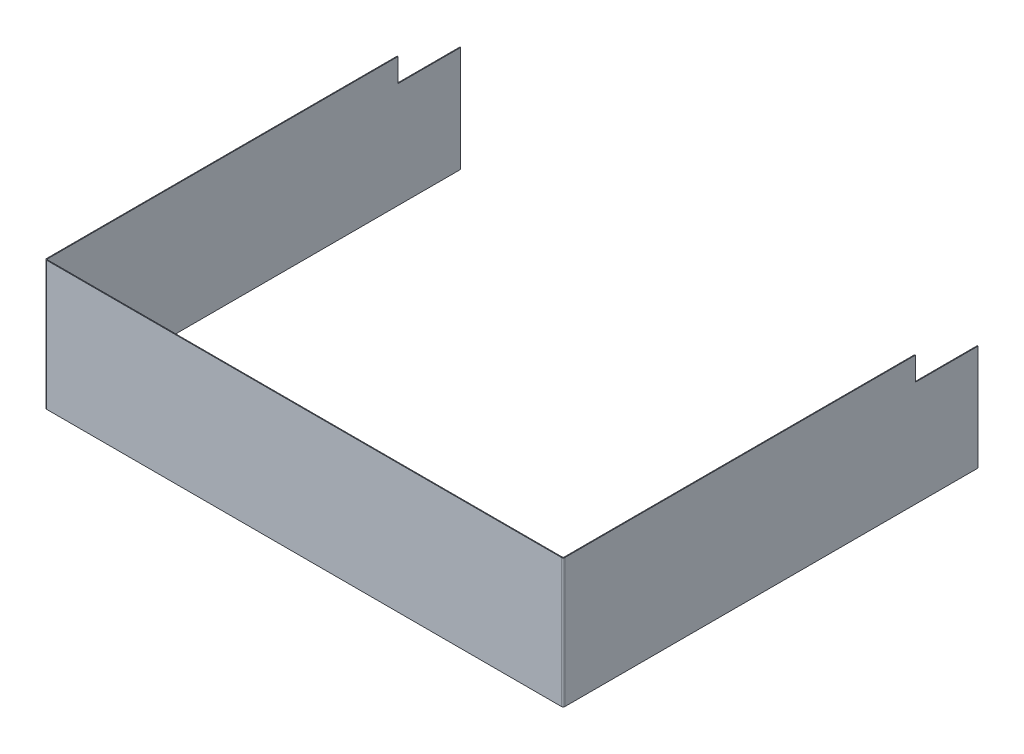
ISO-10303-21;
HEADER;
FILE_DESCRIPTION(('STEP AP214'),'2;1');
FILE_NAME('part.step','',(''),(''),'','','');
FILE_SCHEMA(('AUTOMOTIVE_DESIGN { 1 0 10303 214 1 1 1 1 }'));
ENDSEC;
DATA;
#1=APPLICATION_CONTEXT('core data for automotive mechanical design processes');
#2=APPLICATION_PROTOCOL_DEFINITION('international standard','automotive_design',2000,#1);
#3=PRODUCT_CONTEXT('',#1,'mechanical');
#4=PRODUCT('Part','Part','',(#3));
#5=PRODUCT_RELATED_PRODUCT_CATEGORY('part','',(#4));
#6=PRODUCT_DEFINITION_FORMATION('','',#4);
#7=PRODUCT_DEFINITION_CONTEXT('part definition',#1,'design');
#8=PRODUCT_DEFINITION('design','',#6,#7);
#9=PRODUCT_DEFINITION_SHAPE('','',#8);
#10=(LENGTH_UNIT() NAMED_UNIT(*) SI_UNIT(.MILLI.,.METRE.));
#11=(NAMED_UNIT(*) PLANE_ANGLE_UNIT() SI_UNIT($,.RADIAN.));
#12=(NAMED_UNIT(*) SI_UNIT($,.STERADIAN.) SOLID_ANGLE_UNIT());
#13=UNCERTAINTY_MEASURE_WITH_UNIT(LENGTH_MEASURE(1.E-05),#10,'distance_accuracy_value','');
#14=(GEOMETRIC_REPRESENTATION_CONTEXT(3) GLOBAL_UNCERTAINTY_ASSIGNED_CONTEXT((#13)) GLOBAL_UNIT_ASSIGNED_CONTEXT((#10,
#11,#12)) REPRESENTATION_CONTEXT('',''));
#15=CARTESIAN_POINT('',(0.,0.,0.));
#16=DIRECTION('',(0.,0.,1.));
#17=DIRECTION('',(1.,0.,0.));
#18=AXIS2_PLACEMENT_3D('',#15,#16,#17);
#19=CARTESIAN_POINT('',(0.,0.,-1.));
#20=DIRECTION('',(0.,0.,1.));
#21=DIRECTION('',(1.,0.,0.));
#22=AXIS2_PLACEMENT_3D('',#19,#20,#21);
#23=PLANE('',#22);
#24=DIRECTION('',(0.,1.,0.));
#25=VECTOR('',#24,1.);
#26=CARTESIAN_POINT('',(-329.,82.5,-1.));
#27=LINE('',#26,#25);
#28=CARTESIAN_POINT('',(-329.,82.4999999999999,-1.));
#29=VERTEX_POINT('',#28);
#30=CARTESIAN_POINT('',(-329.,-82.5,-1.));
#31=VERTEX_POINT('',#30);
#32=EDGE_CURVE('E208',#29,#31,#27,.F.);
#33=ORIENTED_EDGE('',*,*,#32,.F.);
#34=DIRECTION('',(-1.,0.,0.));
#35=VECTOR('',#34,1.);
#36=CARTESIAN_POINT('',(330.,82.5,-1.));
#37=LINE('',#36,#35);
#38=CARTESIAN_POINT('',(329.,82.5,-1.));
#39=VERTEX_POINT('',#38);
#40=EDGE_CURVE('E48',#39,#29,#37,.T.);
#41=ORIENTED_EDGE('',*,*,#40,.F.);
#42=DIRECTION('',(0.,-1.,0.));
#43=VECTOR('',#42,1.);
#44=CARTESIAN_POINT('',(329.,-82.5,-1.));
#45=LINE('',#44,#43);
#46=CARTESIAN_POINT('',(329.,-82.5,-1.));
#47=VERTEX_POINT('',#46);
#48=EDGE_CURVE('E261',#47,#39,#45,.F.);
#49=ORIENTED_EDGE('',*,*,#48,.F.);
#50=DIRECTION('',(1.,0.,0.));
#51=VECTOR('',#50,1.);
#52=CARTESIAN_POINT('',(330.,-82.5,-1.));
#53=LINE('',#52,#51);
#54=EDGE_CURVE('E271',#31,#47,#53,.T.);
#55=ORIENTED_EDGE('',*,*,#54,.F.);
#56=EDGE_LOOP('',(#33,#41,#49,#55));
#57=FACE_BOUND('',#56,.T.);
#58=ADVANCED_FACE('F40',(#57),#23,.F.);
#59=CARTESIAN_POINT('',(0.,0.,0.));
#60=DIRECTION('',(0.,0.,1.));
#61=DIRECTION('',(1.,0.,0.));
#62=AXIS2_PLACEMENT_3D('',#59,#60,#61);
#63=PLANE('',#62);
#64=DIRECTION('',(-1.,0.,0.));
#65=VECTOR('',#64,1.);
#66=CARTESIAN_POINT('',(330.,82.5,0.));
#67=LINE('',#66,#65);
#68=CARTESIAN_POINT('',(329.,82.5,0.));
#69=VERTEX_POINT('',#68);
#70=CARTESIAN_POINT('',(-329.,82.4999999999999,0.));
#71=VERTEX_POINT('',#70);
#72=EDGE_CURVE('E274',#69,#71,#67,.T.);
#73=ORIENTED_EDGE('',*,*,#72,.T.);
#74=DIRECTION('',(0.,1.,0.));
#75=VECTOR('',#74,1.);
#76=CARTESIAN_POINT('',(-329.,82.5,0.));
#77=LINE('',#76,#75);
#78=CARTESIAN_POINT('',(-329.,-82.5,0.));
#79=VERTEX_POINT('',#78);
#80=EDGE_CURVE('E195',#71,#79,#77,.F.);
#81=ORIENTED_EDGE('',*,*,#80,.T.);
#82=DIRECTION('',(1.,0.,0.));
#83=VECTOR('',#82,1.);
#84=CARTESIAN_POINT('',(330.,-82.5,0.));
#85=LINE('',#84,#83);
#86=CARTESIAN_POINT('',(329.,-82.5,0.));
#87=VERTEX_POINT('',#86);
#88=EDGE_CURVE('E268',#79,#87,#85,.T.);
#89=ORIENTED_EDGE('',*,*,#88,.T.);
#90=DIRECTION('',(0.,-1.,0.));
#91=VECTOR('',#90,1.);
#92=CARTESIAN_POINT('',(329.,-82.5,0.));
#93=LINE('',#92,#91);
#94=EDGE_CURVE('E248',#87,#69,#93,.F.);
#95=ORIENTED_EDGE('',*,*,#94,.T.);
#96=EDGE_LOOP('',(#73,#81,#89,#95));
#97=FACE_BOUND('',#96,.T.);
#98=ADVANCED_FACE('F281',(#97),#63,.T.);
#99=CARTESIAN_POINT('',(330.,82.5,-1.));
#100=DIRECTION('',(0.,1.,0.));
#101=DIRECTION('',(-1.,0.,0.));
#102=AXIS2_PLACEMENT_3D('',#99,#100,#101);
#103=PLANE('',#102);
#104=ORIENTED_EDGE('',*,*,#40,.T.);
#105=DIRECTION('',(0.,0.,1.));
#106=VECTOR('',#105,1.);
#107=CARTESIAN_POINT('',(-329.,82.4999999999999,-1.));
#108=LINE('',#107,#106);
#109=EDGE_CURVE('E202',#29,#71,#108,.T.);
#110=ORIENTED_EDGE('',*,*,#109,.T.);
#111=ORIENTED_EDGE('',*,*,#72,.F.);
#112=DIRECTION('',(0.,0.,1.));
#113=VECTOR('',#112,1.);
#114=CARTESIAN_POINT('',(329.,82.5,-1.));
#115=LINE('',#114,#113);
#116=EDGE_CURVE('E265',#39,#69,#115,.T.);
#117=ORIENTED_EDGE('',*,*,#116,.F.);
#118=EDGE_LOOP('',(#104,#110,#111,#117));
#119=FACE_BOUND('',#118,.T.);
#120=ADVANCED_FACE('F285',(#119),#103,.T.);
#121=CARTESIAN_POINT('',(330.,-82.5,-1.));
#122=DIRECTION('',(0.,-1.,0.));
#123=DIRECTION('',(1.,0.,0.));
#124=AXIS2_PLACEMENT_3D('',#121,#122,#123);
#125=PLANE('',#124);
#126=DIRECTION('',(0.,0.,1.));
#127=VECTOR('',#126,1.);
#128=CARTESIAN_POINT('',(-329.,-82.5,-1.));
#129=LINE('',#128,#127);
#130=EDGE_CURVE('E212',#31,#79,#129,.T.);
#131=ORIENTED_EDGE('',*,*,#130,.F.);
#132=ORIENTED_EDGE('',*,*,#54,.T.);
#133=DIRECTION('',(0.,0.,1.));
#134=VECTOR('',#133,1.);
#135=CARTESIAN_POINT('',(329.,-82.5,-1.));
#136=LINE('',#135,#134);
#137=EDGE_CURVE('E255',#47,#87,#136,.T.);
#138=ORIENTED_EDGE('',*,*,#137,.T.);
#139=ORIENTED_EDGE('',*,*,#88,.F.);
#140=EDGE_LOOP('',(#131,#132,#138,#139));
#141=FACE_BOUND('',#140,.T.);
#142=ADVANCED_FACE('F42',(#141),#125,.T.);
#143=CARTESIAN_POINT('',(329.,82.5,-2.00000000000001));
#144=DIRECTION('',(0.,1.,0.));
#145=DIRECTION('',(0.,0.,1.));
#146=AXIS2_PLACEMENT_3D('',#143,#144,#145);
#147=PLANE('',#146);
#148=DIRECTION('',(1.,0.,0.));
#149=VECTOR('',#148,1.);
#150=CARTESIAN_POINT('',(330.,82.5,-2.));
#151=LINE('',#150,#149);
#152=CARTESIAN_POINT('',(330.,82.5,-2.));
#153=VERTEX_POINT('',#152);
#154=CARTESIAN_POINT('',(331.,82.5,-2.));
#155=VERTEX_POINT('',#154);
#156=EDGE_CURVE('E215',#153,#155,#151,.T.);
#157=ORIENTED_EDGE('',*,*,#156,.F.);
#158=CARTESIAN_POINT('',(329.,82.5,-2.00000000000001));
#159=DIRECTION('',(0.,-1.,0.));
#160=DIRECTION('',(0.,0.,-1.));
#161=AXIS2_PLACEMENT_3D('',#158,#159,#160);
#162=CIRCLE('',#161,1.);
#163=EDGE_CURVE('E258',#39,#153,#162,.F.);
#164=ORIENTED_EDGE('',*,*,#163,.F.);
#165=ORIENTED_EDGE('',*,*,#116,.T.);
#166=CARTESIAN_POINT('',(329.,82.5,-2.00000000000001));
#167=DIRECTION('',(0.,-1.,0.));
#168=DIRECTION('',(0.,0.,-1.));
#169=AXIS2_PLACEMENT_3D('',#166,#167,#168);
#170=CIRCLE('',#169,2.);
#171=EDGE_CURVE('E251',#69,#155,#170,.F.);
#172=ORIENTED_EDGE('',*,*,#171,.T.);
#173=EDGE_LOOP('',(#157,#164,#165,#172));
#174=FACE_BOUND('',#173,.T.);
#175=ADVANCED_FACE('F357',(#174),#147,.T.);
#176=CARTESIAN_POINT('',(329.,-82.5,-2.00000000000001));
#177=DIRECTION('',(0.,1.,0.));
#178=DIRECTION('',(0.,0.,1.));
#179=AXIS2_PLACEMENT_3D('',#176,#177,#178);
#180=PLANE('',#179);
#181=CARTESIAN_POINT('',(329.,-82.5,-2.00000000000001));
#182=DIRECTION('',(0.,-1.,0.));
#183=DIRECTION('',(0.,0.,-1.));
#184=AXIS2_PLACEMENT_3D('',#181,#182,#183);
#185=CIRCLE('',#184,1.);
#186=CARTESIAN_POINT('',(330.,-82.5,-2.));
#187=VERTEX_POINT('',#186);
#188=EDGE_CURVE('E247',#187,#47,#185,.T.);
#189=ORIENTED_EDGE('',*,*,#188,.F.);
#190=DIRECTION('',(1.,0.,0.));
#191=VECTOR('',#190,1.);
#192=CARTESIAN_POINT('',(330.,-82.5,-2.));
#193=LINE('',#192,#191);
#194=CARTESIAN_POINT('',(331.,-82.5,-2.));
#195=VERTEX_POINT('',#194);
#196=EDGE_CURVE('E220',#187,#195,#193,.T.);
#197=ORIENTED_EDGE('',*,*,#196,.T.);
#198=CARTESIAN_POINT('',(329.,-82.5,-2.00000000000001));
#199=DIRECTION('',(0.,-1.,0.));
#200=DIRECTION('',(0.,0.,-1.));
#201=AXIS2_PLACEMENT_3D('',#198,#199,#200);
#202=CIRCLE('',#201,2.);
#203=EDGE_CURVE('E252',#195,#87,#202,.T.);
#204=ORIENTED_EDGE('',*,*,#203,.T.);
#205=ORIENTED_EDGE('',*,*,#137,.F.);
#206=EDGE_LOOP('',(#189,#197,#204,#205));
#207=FACE_BOUND('',#206,.T.);
#208=ADVANCED_FACE('F351',(#207),#180,.F.);
#209=CARTESIAN_POINT('',(329.,-82.5,-2.00000000000001));
#210=DIRECTION('',(0.,-1.,0.));
#211=DIRECTION('',(1.,0.,0.));
#212=AXIS2_PLACEMENT_3D('',#209,#210,#211);
#213=CYLINDRICAL_SURFACE('',#212,2.);
#214=ORIENTED_EDGE('',*,*,#94,.F.);
#215=ORIENTED_EDGE('',*,*,#203,.F.);
#216=DIRECTION('',(0.,-1.,0.));
#217=VECTOR('',#216,1.);
#218=CARTESIAN_POINT('',(331.,0.,-2.));
#219=LINE('',#218,#217);
#220=EDGE_CURVE('E223',#155,#195,#219,.T.);
#221=ORIENTED_EDGE('',*,*,#220,.F.);
#222=ORIENTED_EDGE('',*,*,#171,.F.);
#223=EDGE_LOOP('',(#214,#215,#221,#222));
#224=FACE_BOUND('',#223,.T.);
#225=ADVANCED_FACE('F365',(#224),#213,.T.);
#226=CARTESIAN_POINT('',(329.,-82.5,-2.00000000000001));
#227=DIRECTION('',(0.,-1.,0.));
#228=DIRECTION('',(1.,0.,0.));
#229=AXIS2_PLACEMENT_3D('',#226,#227,#228);
#230=CYLINDRICAL_SURFACE('',#229,1.);
#231=ORIENTED_EDGE('',*,*,#48,.T.);
#232=ORIENTED_EDGE('',*,*,#163,.T.);
#233=DIRECTION('',(0.,-1.,0.));
#234=VECTOR('',#233,1.);
#235=CARTESIAN_POINT('',(330.,82.5,-2.));
#236=LINE('',#235,#234);
#237=EDGE_CURVE('E218',#153,#187,#236,.T.);
#238=ORIENTED_EDGE('',*,*,#237,.T.);
#239=ORIENTED_EDGE('',*,*,#188,.T.);
#240=EDGE_LOOP('',(#231,#232,#238,#239));
#241=FACE_BOUND('',#240,.T.);
#242=ADVANCED_FACE('F368',(#241),#230,.F.);
#243=CARTESIAN_POINT('',(331.,-82.5,-0.999999999999997));
#244=DIRECTION('',(0.,-1.,0.));
#245=DIRECTION('',(0.,0.,-1.));
#246=AXIS2_PLACEMENT_3D('',#243,#244,#245);
#247=PLANE('',#246);
#248=DIRECTION('',(0.,0.,1.));
#249=VECTOR('',#248,1.);
#250=CARTESIAN_POINT('',(331.,-82.5,-0.999999999999997));
#251=LINE('',#250,#249);
#252=CARTESIAN_POINT('',(331.000000000002,-82.5,-530.));
#253=VERTEX_POINT('',#252);
#254=EDGE_CURVE('E235',#253,#195,#251,.T.);
#255=ORIENTED_EDGE('',*,*,#254,.T.);
#256=ORIENTED_EDGE('',*,*,#196,.F.);
#257=DIRECTION('',(0.,0.,1.));
#258=VECTOR('',#257,1.);
#259=CARTESIAN_POINT('',(330.,-82.5,-1.));
#260=LINE('',#259,#258);
#261=CARTESIAN_POINT('',(330.000000000002,-82.5,-530.));
#262=VERTEX_POINT('',#261);
#263=EDGE_CURVE('E233',#262,#187,#260,.T.);
#264=ORIENTED_EDGE('',*,*,#263,.F.);
#265=DIRECTION('',(-1.,0.,0.));
#266=VECTOR('',#265,1.);
#267=CARTESIAN_POINT('',(331.000000000002,-82.5,-530.));
#268=LINE('',#267,#266);
#269=EDGE_CURVE('E238',#253,#262,#268,.T.);
#270=ORIENTED_EDGE('',*,*,#269,.F.);
#271=EDGE_LOOP('',(#255,#256,#264,#270));
#272=FACE_BOUND('',#271,.T.);
#273=ADVANCED_FACE('F371',(#272),#247,.T.);
#274=CARTESIAN_POINT('',(331.000000000002,82.5,-530.));
#275=DIRECTION('',(0.,1.,0.));
#276=DIRECTION('',(0.,0.,1.));
#277=AXIS2_PLACEMENT_3D('',#274,#275,#276);
#278=PLANE('',#277);
#279=DIRECTION('',(1.,0.,0.));
#280=VECTOR('',#279,1.);
#281=CARTESIAN_POINT('',(-331.000000000002,82.5,-450.000000000002));
#282=LINE('',#281,#280);
#283=CARTESIAN_POINT('',(330.000000000002,82.5,-450.));
#284=VERTEX_POINT('',#283);
#285=CARTESIAN_POINT('',(331.000000000002,82.5,-450.));
#286=VERTEX_POINT('',#285);
#287=EDGE_CURVE('E172',#284,#286,#282,.T.);
#288=ORIENTED_EDGE('',*,*,#287,.F.);
#289=DIRECTION('',(0.,0.,-1.));
#290=VECTOR('',#289,1.);
#291=CARTESIAN_POINT('',(330.000000000002,82.5,-530.));
#292=LINE('',#291,#290);
#293=EDGE_CURVE('E228',#153,#284,#292,.T.);
#294=ORIENTED_EDGE('',*,*,#293,.F.);
#295=ORIENTED_EDGE('',*,*,#156,.T.);
#296=DIRECTION('',(0.,0.,-1.));
#297=VECTOR('',#296,1.);
#298=CARTESIAN_POINT('',(331.000000000002,82.5,-530.));
#299=LINE('',#298,#297);
#300=EDGE_CURVE('E229',#155,#286,#299,.T.);
#301=ORIENTED_EDGE('',*,*,#300,.T.);
#302=EDGE_LOOP('',(#288,#294,#295,#301));
#303=FACE_BOUND('',#302,.T.);
#304=ADVANCED_FACE('F376',(#303),#278,.T.);
#305=CARTESIAN_POINT('',(331.,0.,1.1462446702016E-12));
#306=DIRECTION('',(1.,0.,0.));
#307=DIRECTION('',(0.,0.,-1.));
#308=AXIS2_PLACEMENT_3D('',#305,#306,#307);
#309=PLANE('',#308);
#310=DIRECTION('',(0.,0.,-1.));
#311=VECTOR('',#310,1.);
#312=CARTESIAN_POINT('',(331.000000000002,52.5,-530.));
#313=LINE('',#312,#311);
#314=CARTESIAN_POINT('',(331.000000000002,52.5,-450.));
#315=VERTEX_POINT('',#314);
#316=CARTESIAN_POINT('',(331.000000000002,52.5,-530.));
#317=VERTEX_POINT('',#316);
#318=EDGE_CURVE('E55',#315,#317,#313,.T.);
#319=ORIENTED_EDGE('',*,*,#318,.F.);
#320=DIRECTION('',(0.,-1.,0.));
#321=VECTOR('',#320,1.);
#322=CARTESIAN_POINT('',(331.000000000002,52.5,-450.));
#323=LINE('',#322,#321);
#324=EDGE_CURVE('E668',#286,#315,#323,.T.);
#325=ORIENTED_EDGE('',*,*,#324,.F.);
#326=ORIENTED_EDGE('',*,*,#300,.F.);
#327=ORIENTED_EDGE('',*,*,#220,.T.);
#328=ORIENTED_EDGE('',*,*,#254,.F.);
#329=DIRECTION('',(0.,-1.,0.));
#330=VECTOR('',#329,1.);
#331=CARTESIAN_POINT('',(331.000000000002,-82.5,-530.));
#332=LINE('',#331,#330);
#333=EDGE_CURVE('E232',#317,#253,#332,.T.);
#334=ORIENTED_EDGE('',*,*,#333,.F.);
#335=EDGE_LOOP('',(#319,#325,#326,#327,#328,#334));
#336=FACE_BOUND('',#335,.T.);
#337=ADVANCED_FACE('F379',(#336),#309,.T.);
#338=CARTESIAN_POINT('',(330.,0.,1.14275318886276E-12));
#339=DIRECTION('',(1.,0.,0.));
#340=DIRECTION('',(0.,0.,-1.));
#341=AXIS2_PLACEMENT_3D('',#338,#339,#340);
#342=PLANE('',#341);
#343=DIRECTION('',(0.,-1.,0.));
#344=VECTOR('',#343,1.);
#345=CARTESIAN_POINT('',(330.000000000002,0.,-450.));
#346=LINE('',#345,#344);
#347=CARTESIAN_POINT('',(330.000000000002,52.5,-450.));
#348=VERTEX_POINT('',#347);
#349=EDGE_CURVE('E323',#284,#348,#346,.T.);
#350=ORIENTED_EDGE('',*,*,#349,.T.);
#351=DIRECTION('',(0.,0.,-1.));
#352=VECTOR('',#351,1.);
#353=CARTESIAN_POINT('',(330.,52.4999999999999,1.15186048711163E-12));
#354=LINE('',#353,#352);
#355=CARTESIAN_POINT('',(330.000000000002,52.5,-530.));
#356=VERTEX_POINT('',#355);
#357=EDGE_CURVE('E320',#348,#356,#354,.T.);
#358=ORIENTED_EDGE('',*,*,#357,.T.);
#359=DIRECTION('',(0.,-1.,0.));
#360=VECTOR('',#359,1.);
#361=CARTESIAN_POINT('',(330.000000000002,-82.5,-530.));
#362=LINE('',#361,#360);
#363=EDGE_CURVE('E241',#356,#262,#362,.T.);
#364=ORIENTED_EDGE('',*,*,#363,.T.);
#365=ORIENTED_EDGE('',*,*,#263,.T.);
#366=ORIENTED_EDGE('',*,*,#237,.F.);
#367=ORIENTED_EDGE('',*,*,#293,.T.);
#368=EDGE_LOOP('',(#350,#358,#364,#365,#366,#367));
#369=FACE_BOUND('',#368,.T.);
#370=ADVANCED_FACE('F384',(#369),#342,.F.);
#371=CARTESIAN_POINT('',(331.000000000002,-82.5,-530.));
#372=DIRECTION('',(0.,0.,-1.));
#373=DIRECTION('',(-1.,0.,0.));
#374=AXIS2_PLACEMENT_3D('',#371,#372,#373);
#375=PLANE('',#374);
#376=DIRECTION('',(1.,0.,0.));
#377=VECTOR('',#376,1.);
#378=CARTESIAN_POINT('',(-331.000000000002,52.5,-530.000000000002));
#379=LINE('',#378,#377);
#380=EDGE_CURVE('E325',#356,#317,#379,.T.);
#381=ORIENTED_EDGE('',*,*,#380,.T.);
#382=ORIENTED_EDGE('',*,*,#333,.T.);
#383=ORIENTED_EDGE('',*,*,#269,.T.);
#384=ORIENTED_EDGE('',*,*,#363,.F.);
#385=EDGE_LOOP('',(#381,#382,#383,#384));
#386=FACE_BOUND('',#385,.T.);
#387=ADVANCED_FACE('F381',(#386),#375,.T.);
#388=CARTESIAN_POINT('',(-329.,-82.5,-2.00000000000001));
#389=DIRECTION('',(0.,-1.,0.));
#390=DIRECTION('',(0.,0.,-1.));
#391=AXIS2_PLACEMENT_3D('',#388,#389,#390);
#392=PLANE('',#391);
#393=DIRECTION('',(-1.,0.,0.));
#394=VECTOR('',#393,1.);
#395=CARTESIAN_POINT('',(-330.,-82.5,-2.));
#396=LINE('',#395,#394);
#397=CARTESIAN_POINT('',(-330.,-82.5,-2.));
#398=VERTEX_POINT('',#397);
#399=CARTESIAN_POINT('',(-331.,-82.5,-2.));
#400=VERTEX_POINT('',#399);
#401=EDGE_CURVE('E306',#398,#400,#396,.T.);
#402=ORIENTED_EDGE('',*,*,#401,.F.);
#403=CARTESIAN_POINT('',(-329.,-82.5,-2.00000000000001));
#404=DIRECTION('',(0.,1.,0.));
#405=DIRECTION('',(0.,0.,1.));
#406=AXIS2_PLACEMENT_3D('',#403,#404,#405);
#407=CIRCLE('',#406,1.);
#408=EDGE_CURVE('E205',#31,#398,#407,.F.);
#409=ORIENTED_EDGE('',*,*,#408,.F.);
#410=ORIENTED_EDGE('',*,*,#130,.T.);
#411=CARTESIAN_POINT('',(-329.,-82.5,-2.00000000000001));
#412=DIRECTION('',(0.,1.,0.));
#413=DIRECTION('',(0.,0.,1.));
#414=AXIS2_PLACEMENT_3D('',#411,#412,#413);
#415=CIRCLE('',#414,2.);
#416=EDGE_CURVE('E198',#79,#400,#415,.F.);
#417=ORIENTED_EDGE('',*,*,#416,.T.);
#418=EDGE_LOOP('',(#402,#409,#410,#417));
#419=FACE_BOUND('',#418,.T.);
#420=ADVANCED_FACE('F304',(#419),#392,.T.);
#421=CARTESIAN_POINT('',(-329.,82.4999999999999,-2.00000000000001));
#422=DIRECTION('',(0.,-1.,0.));
#423=DIRECTION('',(0.,0.,-1.));
#424=AXIS2_PLACEMENT_3D('',#421,#422,#423);
#425=PLANE('',#424);
#426=CARTESIAN_POINT('',(-329.,82.4999999999999,-2.00000000000001));
#427=DIRECTION('',(0.,1.,0.));
#428=DIRECTION('',(0.,0.,1.));
#429=AXIS2_PLACEMENT_3D('',#426,#427,#428);
#430=CIRCLE('',#429,1.);
#431=CARTESIAN_POINT('',(-330.,82.4999999999999,-2.));
#432=VERTEX_POINT('',#431);
#433=EDGE_CURVE('E182',#432,#29,#430,.T.);
#434=ORIENTED_EDGE('',*,*,#433,.F.);
#435=DIRECTION('',(-1.,0.,0.));
#436=VECTOR('',#435,1.);
#437=CARTESIAN_POINT('',(-330.,82.4999999999999,-2.));
#438=LINE('',#437,#436);
#439=CARTESIAN_POINT('',(-331.,82.4999999999999,-2.));
#440=VERTEX_POINT('',#439);
#441=EDGE_CURVE('E310',#432,#440,#438,.T.);
#442=ORIENTED_EDGE('',*,*,#441,.T.);
#443=CARTESIAN_POINT('',(-329.,82.4999999999999,-2.00000000000001));
#444=DIRECTION('',(0.,1.,0.));
#445=DIRECTION('',(0.,0.,1.));
#446=AXIS2_PLACEMENT_3D('',#443,#444,#445);
#447=CIRCLE('',#446,2.);
#448=EDGE_CURVE('E199',#440,#71,#447,.T.);
#449=ORIENTED_EDGE('',*,*,#448,.T.);
#450=ORIENTED_EDGE('',*,*,#109,.F.);
#451=EDGE_LOOP('',(#434,#442,#449,#450));
#452=FACE_BOUND('',#451,.T.);
#453=ADVANCED_FACE('F289',(#452),#425,.F.);
#454=CARTESIAN_POINT('',(-329.,82.5,-2.00000000000001));
#455=DIRECTION('',(0.,1.,0.));
#456=DIRECTION('',(-1.,0.,0.));
#457=AXIS2_PLACEMENT_3D('',#454,#455,#456);
#458=CYLINDRICAL_SURFACE('',#457,2.);
#459=ORIENTED_EDGE('',*,*,#80,.F.);
#460=ORIENTED_EDGE('',*,*,#448,.F.);
#461=DIRECTION('',(0.,-1.,0.));
#462=VECTOR('',#461,1.);
#463=CARTESIAN_POINT('',(-331.,0.,-2.));
#464=LINE('',#463,#462);
#465=EDGE_CURVE('E177',#440,#400,#464,.T.);
#466=ORIENTED_EDGE('',*,*,#465,.T.);
#467=ORIENTED_EDGE('',*,*,#416,.F.);
#468=EDGE_LOOP('',(#459,#460,#466,#467));
#469=FACE_BOUND('',#468,.T.);
#470=ADVANCED_FACE('F334',(#469),#458,.T.);
#471=CARTESIAN_POINT('',(-329.,82.5,-2.00000000000001));
#472=DIRECTION('',(0.,1.,0.));
#473=DIRECTION('',(-1.,0.,0.));
#474=AXIS2_PLACEMENT_3D('',#471,#472,#473);
#475=CYLINDRICAL_SURFACE('',#474,1.);
#476=ORIENTED_EDGE('',*,*,#32,.T.);
#477=ORIENTED_EDGE('',*,*,#408,.T.);
#478=DIRECTION('',(0.,1.,0.));
#479=VECTOR('',#478,1.);
#480=CARTESIAN_POINT('',(-330.,-82.5,-2.));
#481=LINE('',#480,#479);
#482=EDGE_CURVE('E297',#398,#432,#481,.T.);
#483=ORIENTED_EDGE('',*,*,#482,.T.);
#484=ORIENTED_EDGE('',*,*,#433,.T.);
#485=EDGE_LOOP('',(#476,#477,#483,#484));
#486=FACE_BOUND('',#485,.T.);
#487=ADVANCED_FACE('F294',(#486),#475,.F.);
#488=CARTESIAN_POINT('',(-331.,-82.5,-0.999999999999997));
#489=DIRECTION('',(0.,-1.,0.));
#490=DIRECTION('',(0.,0.,-1.));
#491=AXIS2_PLACEMENT_3D('',#488,#489,#490);
#492=PLANE('',#491);
#493=DIRECTION('',(0.,0.,-1.));
#494=VECTOR('',#493,1.);
#495=CARTESIAN_POINT('',(-330.,-82.5,-1.));
#496=LINE('',#495,#494);
#497=CARTESIAN_POINT('',(-330.000000000002,-82.5,-530.));
#498=VERTEX_POINT('',#497);
#499=EDGE_CURVE('E189',#398,#498,#496,.T.);
#500=ORIENTED_EDGE('',*,*,#499,.F.);
#501=ORIENTED_EDGE('',*,*,#401,.T.);
#502=DIRECTION('',(0.,0.,-1.));
#503=VECTOR('',#502,1.);
#504=CARTESIAN_POINT('',(-331.,-82.5,-0.999999999999997));
#505=LINE('',#504,#503);
#506=CARTESIAN_POINT('',(-331.000000000002,-82.5,-530.));
#507=VERTEX_POINT('',#506);
#508=EDGE_CURVE('E185',#400,#507,#505,.T.);
#509=ORIENTED_EDGE('',*,*,#508,.T.);
#510=DIRECTION('',(1.,0.,0.));
#511=VECTOR('',#510,1.);
#512=CARTESIAN_POINT('',(-331.000000000002,-82.5,-530.));
#513=LINE('',#512,#511);
#514=EDGE_CURVE('E178',#507,#498,#513,.T.);
#515=ORIENTED_EDGE('',*,*,#514,.T.);
#516=EDGE_LOOP('',(#500,#501,#509,#515));
#517=FACE_BOUND('',#516,.T.);
#518=ADVANCED_FACE('F313',(#517),#492,.T.);
#519=CARTESIAN_POINT('',(-331.000000000002,82.5,-530.));
#520=DIRECTION('',(0.,1.,0.));
#521=DIRECTION('',(0.,0.,1.));
#522=AXIS2_PLACEMENT_3D('',#519,#520,#521);
#523=PLANE('',#522);
#524=CARTESIAN_POINT('',(-331.000000000002,82.5,-450.000000000002));
#525=VERTEX_POINT('',#524);
#526=CARTESIAN_POINT('',(-330.000000000002,82.5,-450.000000000002));
#527=VERTEX_POINT('',#526);
#528=EDGE_CURVE('E155',#525,#527,#282,.T.);
#529=ORIENTED_EDGE('',*,*,#528,.F.);
#530=DIRECTION('',(0.,0.,1.));
#531=VECTOR('',#530,1.);
#532=CARTESIAN_POINT('',(-331.000000000002,82.5,-530.));
#533=LINE('',#532,#531);
#534=EDGE_CURVE('E168',#525,#440,#533,.T.);
#535=ORIENTED_EDGE('',*,*,#534,.T.);
#536=ORIENTED_EDGE('',*,*,#441,.F.);
#537=DIRECTION('',(0.,0.,1.));
#538=VECTOR('',#537,1.);
#539=CARTESIAN_POINT('',(-330.000000000002,82.5,-530.));
#540=LINE('',#539,#538);
#541=EDGE_CURVE('E170',#527,#432,#540,.T.);
#542=ORIENTED_EDGE('',*,*,#541,.F.);
#543=EDGE_LOOP('',(#529,#535,#536,#542));
#544=FACE_BOUND('',#543,.T.);
#545=ADVANCED_FACE('F166',(#544),#523,.T.);
#546=CARTESIAN_POINT('',(-331.,0.,1.1462446702016E-12));
#547=DIRECTION('',(1.,0.,0.));
#548=DIRECTION('',(0.,0.,-1.));
#549=AXIS2_PLACEMENT_3D('',#546,#547,#548);
#550=PLANE('',#549);
#551=DIRECTION('',(0.,-1.,0.));
#552=VECTOR('',#551,1.);
#553=CARTESIAN_POINT('',(-331.000000000002,52.5,-450.000000000002));
#554=LINE('',#553,#552);
#555=CARTESIAN_POINT('',(-331.000000000002,52.5,-450.000000000002));
#556=VERTEX_POINT('',#555);
#557=EDGE_CURVE('E152',#525,#556,#554,.T.);
#558=ORIENTED_EDGE('',*,*,#557,.T.);
#559=DIRECTION('',(0.,0.,-1.));
#560=VECTOR('',#559,1.);
#561=CARTESIAN_POINT('',(-331.000000000002,52.5,-530.000000000002));
#562=LINE('',#561,#560);
#563=CARTESIAN_POINT('',(-331.000000000002,52.5,-530.000000000002));
#564=VERTEX_POINT('',#563);
#565=EDGE_CURVE('E162',#556,#564,#562,.T.);
#566=ORIENTED_EDGE('',*,*,#565,.T.);
#567=DIRECTION('',(0.,1.,0.));
#568=VECTOR('',#567,1.);
#569=CARTESIAN_POINT('',(-331.000000000002,-82.5,-530.));
#570=LINE('',#569,#568);
#571=EDGE_CURVE('E179',#507,#564,#570,.T.);
#572=ORIENTED_EDGE('',*,*,#571,.F.);
#573=ORIENTED_EDGE('',*,*,#508,.F.);
#574=ORIENTED_EDGE('',*,*,#465,.F.);
#575=ORIENTED_EDGE('',*,*,#534,.F.);
#576=EDGE_LOOP('',(#558,#566,#572,#573,#574,#575));
#577=FACE_BOUND('',#576,.T.);
#578=ADVANCED_FACE('F175',(#577),#550,.F.);
#579=CARTESIAN_POINT('',(-330.,0.,1.14275318886276E-12));
#580=DIRECTION('',(1.,0.,0.));
#581=DIRECTION('',(0.,0.,-1.));
#582=AXIS2_PLACEMENT_3D('',#579,#580,#581);
#583=PLANE('',#582);
#584=DIRECTION('',(0.,0.,-1.));
#585=VECTOR('',#584,1.);
#586=CARTESIAN_POINT('',(-330.,52.4999999999999,1.15186048711163E-12));
#587=LINE('',#586,#585);
#588=CARTESIAN_POINT('',(-330.000000000002,52.5,-450.000000000002));
#589=VERTEX_POINT('',#588);
#590=CARTESIAN_POINT('',(-330.000000000002,52.4999999999999,-530.));
#591=VERTEX_POINT('',#590);
#592=EDGE_CURVE('E63',#589,#591,#587,.T.);
#593=ORIENTED_EDGE('',*,*,#592,.F.);
#594=DIRECTION('',(0.,-1.,0.));
#595=VECTOR('',#594,1.);
#596=CARTESIAN_POINT('',(-330.000000000002,0.,-450.000000000002));
#597=LINE('',#596,#595);
#598=EDGE_CURVE('E11',#527,#589,#597,.T.);
#599=ORIENTED_EDGE('',*,*,#598,.F.);
#600=ORIENTED_EDGE('',*,*,#541,.T.);
#601=ORIENTED_EDGE('',*,*,#482,.F.);
#602=ORIENTED_EDGE('',*,*,#499,.T.);
#603=DIRECTION('',(0.,1.,0.));
#604=VECTOR('',#603,1.);
#605=CARTESIAN_POINT('',(-330.000000000002,-82.5,-530.));
#606=LINE('',#605,#604);
#607=EDGE_CURVE('E191',#498,#591,#606,.T.);
#608=ORIENTED_EDGE('',*,*,#607,.T.);
#609=EDGE_LOOP('',(#593,#599,#600,#601,#602,#608));
#610=FACE_BOUND('',#609,.T.);
#611=ADVANCED_FACE('F309',(#610),#583,.T.);
#612=CARTESIAN_POINT('',(-331.000000000002,-82.5,-530.));
#613=DIRECTION('',(0.,0.,-1.));
#614=DIRECTION('',(-1.,0.,0.));
#615=AXIS2_PLACEMENT_3D('',#612,#613,#614);
#616=PLANE('',#615);
#617=EDGE_CURVE('E319',#564,#591,#379,.T.);
#618=ORIENTED_EDGE('',*,*,#617,.T.);
#619=ORIENTED_EDGE('',*,*,#607,.F.);
#620=ORIENTED_EDGE('',*,*,#514,.F.);
#621=ORIENTED_EDGE('',*,*,#571,.T.);
#622=EDGE_LOOP('',(#618,#619,#620,#621));
#623=FACE_BOUND('',#622,.T.);
#624=ADVANCED_FACE('F318',(#623),#616,.T.);
#625=CARTESIAN_POINT('',(-331.000000000002,52.5,-530.000000000002));
#626=DIRECTION('',(0.,-1.,0.));
#627=DIRECTION('',(0.,0.,-1.));
#628=AXIS2_PLACEMENT_3D('',#625,#626,#627);
#629=PLANE('',#628);
#630=ORIENTED_EDGE('',*,*,#592,.T.);
#631=ORIENTED_EDGE('',*,*,#617,.F.);
#632=ORIENTED_EDGE('',*,*,#565,.F.);
#633=DIRECTION('',(1.,0.,0.));
#634=VECTOR('',#633,1.);
#635=CARTESIAN_POINT('',(-331.000000000002,52.5,-450.000000000002));
#636=LINE('',#635,#634);
#637=EDGE_CURVE('E157',#556,#589,#636,.T.);
#638=ORIENTED_EDGE('',*,*,#637,.T.);
#639=EDGE_LOOP('',(#630,#631,#632,#638));
#640=FACE_BOUND('',#639,.T.);
#641=ADVANCED_FACE('F466',(#640),#629,.F.);
#642=CARTESIAN_POINT('',(-331.000000000002,52.5,-450.000000000002));
#643=DIRECTION('',(0.,0.,1.));
#644=DIRECTION('',(1.,0.,0.));
#645=AXIS2_PLACEMENT_3D('',#642,#643,#644);
#646=PLANE('',#645);
#647=ORIENTED_EDGE('',*,*,#598,.T.);
#648=ORIENTED_EDGE('',*,*,#637,.F.);
#649=ORIENTED_EDGE('',*,*,#557,.F.);
#650=ORIENTED_EDGE('',*,*,#528,.T.);
#651=EDGE_LOOP('',(#647,#648,#649,#650));
#652=FACE_BOUND('',#651,.T.);
#653=ADVANCED_FACE('F154',(#652),#646,.F.);
#654=ORIENTED_EDGE('',*,*,#287,.T.);
#655=ORIENTED_EDGE('',*,*,#324,.T.);
#656=EDGE_CURVE('E171',#348,#315,#636,.T.);
#657=ORIENTED_EDGE('',*,*,#656,.F.);
#658=ORIENTED_EDGE('',*,*,#349,.F.);
#659=EDGE_LOOP('',(#654,#655,#657,#658));
#660=FACE_BOUND('',#659,.T.);
#661=ADVANCED_FACE('F484',(#660),#646,.F.);
#662=ORIENTED_EDGE('',*,*,#656,.T.);
#663=ORIENTED_EDGE('',*,*,#318,.T.);
#664=ORIENTED_EDGE('',*,*,#380,.F.);
#665=ORIENTED_EDGE('',*,*,#357,.F.);
#666=EDGE_LOOP('',(#662,#663,#664,#665));
#667=FACE_BOUND('',#666,.T.);
#668=ADVANCED_FACE('F475',(#667),#629,.F.);
#669=CLOSED_SHELL('',(#58,#98,#120,#142,#175,#208,#225,#242,#273,#304,#337,#370,#387,#420,#453,
#470,#487,#518,#545,#578,#611,#624,#641,#653,#661,#668));
#670=MANIFOLD_SOLID_BREP('B2',#669);
#671=ADVANCED_BREP_SHAPE_REPRESENTATION('',(#18,#670),#14);
#672=SHAPE_DEFINITION_REPRESENTATION(#9,#671);
ENDSEC;
END-ISO-10303-21;
